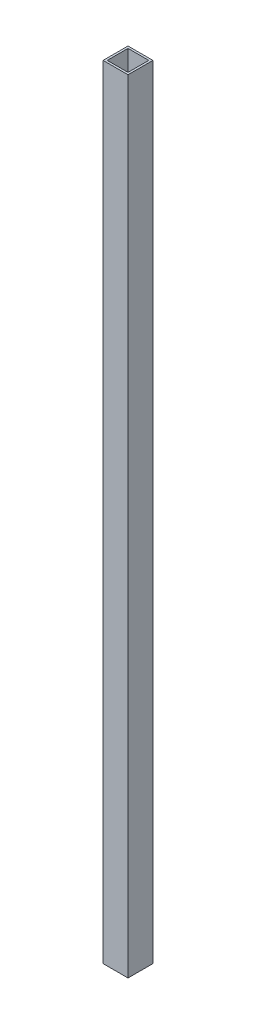
ISO-10303-21;
HEADER;
FILE_DESCRIPTION(('STEP AP214'),'2;1');
FILE_NAME('part.step','',(''),(''),'','','');
FILE_SCHEMA(('AUTOMOTIVE_DESIGN { 1 0 10303 214 1 1 1 1 }'));
ENDSEC;
DATA;
#1=APPLICATION_CONTEXT('core data for automotive mechanical design processes');
#2=APPLICATION_PROTOCOL_DEFINITION('international standard','automotive_design',2000,#1);
#3=PRODUCT_CONTEXT('',#1,'mechanical');
#4=PRODUCT('Part','Part','',(#3));
#5=PRODUCT_RELATED_PRODUCT_CATEGORY('part','',(#4));
#6=PRODUCT_DEFINITION_FORMATION('','',#4);
#7=PRODUCT_DEFINITION_CONTEXT('part definition',#1,'design');
#8=PRODUCT_DEFINITION('design','',#6,#7);
#9=PRODUCT_DEFINITION_SHAPE('','',#8);
#10=(LENGTH_UNIT() NAMED_UNIT(*) SI_UNIT(.MILLI.,.METRE.));
#11=(NAMED_UNIT(*) PLANE_ANGLE_UNIT() SI_UNIT($,.RADIAN.));
#12=(NAMED_UNIT(*) SI_UNIT($,.STERADIAN.) SOLID_ANGLE_UNIT());
#13=UNCERTAINTY_MEASURE_WITH_UNIT(LENGTH_MEASURE(1.E-05),#10,'distance_accuracy_value','');
#14=(GEOMETRIC_REPRESENTATION_CONTEXT(3) GLOBAL_UNCERTAINTY_ASSIGNED_CONTEXT((#13)) GLOBAL_UNIT_ASSIGNED_CONTEXT((#10,
#11,#12)) REPRESENTATION_CONTEXT('',''));
#15=CARTESIAN_POINT('',(0.,0.,0.));
#16=DIRECTION('',(0.,0.,1.));
#17=DIRECTION('',(1.,0.,0.));
#18=AXIS2_PLACEMENT_3D('',#15,#16,#17);
#19=CARTESIAN_POINT('',(0.,152.4,0.));
#20=DIRECTION('',(0.,1.,0.));
#21=DIRECTION('',(0.,0.,1.));
#22=AXIS2_PLACEMENT_3D('',#19,#20,#21);
#23=PLANE('',#22);
#24=DIRECTION('',(0.,0.,-1.));
#25=VECTOR('',#24,1.);
#26=CARTESIAN_POINT('',(2.425,152.4,-2.425));
#27=LINE('',#26,#25);
#28=CARTESIAN_POINT('',(2.425,152.4,2.425));
#29=VERTEX_POINT('',#28);
#30=CARTESIAN_POINT('',(2.425,152.4,-2.425));
#31=VERTEX_POINT('',#30);
#32=EDGE_CURVE('E135',#29,#31,#27,.T.);
#33=ORIENTED_EDGE('',*,*,#32,.T.);
#34=DIRECTION('',(-1.,0.,0.));
#35=VECTOR('',#34,1.);
#36=CARTESIAN_POINT('',(-2.425,152.4,-2.425));
#37=LINE('',#36,#35);
#38=CARTESIAN_POINT('',(-2.425,152.4,-2.425));
#39=VERTEX_POINT('',#38);
#40=EDGE_CURVE('E138',#31,#39,#37,.T.);
#41=ORIENTED_EDGE('',*,*,#40,.T.);
#42=DIRECTION('',(0.,0.,1.));
#43=VECTOR('',#42,1.);
#44=CARTESIAN_POINT('',(-2.425,152.4,-2.425));
#45=LINE('',#44,#43);
#46=CARTESIAN_POINT('',(-2.425,152.4,2.425));
#47=VERTEX_POINT('',#46);
#48=EDGE_CURVE('E141',#39,#47,#45,.T.);
#49=ORIENTED_EDGE('',*,*,#48,.T.);
#50=DIRECTION('',(1.,0.,0.));
#51=VECTOR('',#50,1.);
#52=CARTESIAN_POINT('',(-2.425,152.4,2.425));
#53=LINE('',#52,#51);
#54=EDGE_CURVE('E143',#47,#29,#53,.T.);
#55=ORIENTED_EDGE('',*,*,#54,.T.);
#56=EDGE_LOOP('',(#33,#41,#49,#55));
#57=FACE_BOUND('',#56,.T.);
#58=DIRECTION('',(1.,0.,0.));
#59=VECTOR('',#58,1.);
#60=CARTESIAN_POINT('',(-2.025,152.4,2.025));
#61=LINE('',#60,#59);
#62=CARTESIAN_POINT('',(-2.025,152.4,2.025));
#63=VERTEX_POINT('',#62);
#64=CARTESIAN_POINT('',(2.025,152.4,2.025));
#65=VERTEX_POINT('',#64);
#66=EDGE_CURVE('E107',#63,#65,#61,.T.);
#67=ORIENTED_EDGE('',*,*,#66,.F.);
#68=DIRECTION('',(0.,0.,1.));
#69=VECTOR('',#68,1.);
#70=CARTESIAN_POINT('',(-2.025,152.4,-2.025));
#71=LINE('',#70,#69);
#72=CARTESIAN_POINT('',(-2.025,152.4,-2.025));
#73=VERTEX_POINT('',#72);
#74=EDGE_CURVE('E99',#73,#63,#71,.T.);
#75=ORIENTED_EDGE('',*,*,#74,.F.);
#76=DIRECTION('',(-1.,0.,0.));
#77=VECTOR('',#76,1.);
#78=CARTESIAN_POINT('',(-2.025,152.4,-2.025));
#79=LINE('',#78,#77);
#80=CARTESIAN_POINT('',(2.025,152.4,-2.025));
#81=VERTEX_POINT('',#80);
#82=EDGE_CURVE('E121',#81,#73,#79,.T.);
#83=ORIENTED_EDGE('',*,*,#82,.F.);
#84=DIRECTION('',(0.,0.,-1.));
#85=VECTOR('',#84,1.);
#86=CARTESIAN_POINT('',(2.025,152.4,-2.025));
#87=LINE('',#86,#85);
#88=EDGE_CURVE('E119',#65,#81,#87,.T.);
#89=ORIENTED_EDGE('',*,*,#88,.F.);
#90=EDGE_LOOP('',(#67,#75,#83,#89));
#91=FACE_BOUND('',#90,.T.);
#92=ADVANCED_FACE('F34',(#57,#91),#23,.T.);
#93=CARTESIAN_POINT('',(0.,0.,0.));
#94=DIRECTION('',(0.,1.,0.));
#95=DIRECTION('',(0.,0.,1.));
#96=AXIS2_PLACEMENT_3D('',#93,#94,#95);
#97=PLANE('',#96);
#98=DIRECTION('',(0.,0.,-1.));
#99=VECTOR('',#98,1.);
#100=CARTESIAN_POINT('',(2.425,0.,-2.425));
#101=LINE('',#100,#99);
#102=CARTESIAN_POINT('',(2.425,0.,2.425));
#103=VERTEX_POINT('',#102);
#104=CARTESIAN_POINT('',(2.425,0.,-2.425));
#105=VERTEX_POINT('',#104);
#106=EDGE_CURVE('E115',#103,#105,#101,.T.);
#107=ORIENTED_EDGE('',*,*,#106,.F.);
#108=DIRECTION('',(1.,0.,0.));
#109=VECTOR('',#108,1.);
#110=CARTESIAN_POINT('',(-2.425,0.,2.425));
#111=LINE('',#110,#109);
#112=CARTESIAN_POINT('',(-2.425,0.,2.425));
#113=VERTEX_POINT('',#112);
#114=EDGE_CURVE('E139',#113,#103,#111,.T.);
#115=ORIENTED_EDGE('',*,*,#114,.F.);
#116=DIRECTION('',(0.,0.,1.));
#117=VECTOR('',#116,1.);
#118=CARTESIAN_POINT('',(-2.425,0.,-2.425));
#119=LINE('',#118,#117);
#120=CARTESIAN_POINT('',(-2.425,0.,-2.425));
#121=VERTEX_POINT('',#120);
#122=EDGE_CURVE('E150',#121,#113,#119,.T.);
#123=ORIENTED_EDGE('',*,*,#122,.F.);
#124=DIRECTION('',(-1.,0.,0.));
#125=VECTOR('',#124,1.);
#126=CARTESIAN_POINT('',(-2.425,0.,-2.425));
#127=LINE('',#126,#125);
#128=EDGE_CURVE('E148',#105,#121,#127,.T.);
#129=ORIENTED_EDGE('',*,*,#128,.F.);
#130=EDGE_LOOP('',(#107,#115,#123,#129));
#131=FACE_BOUND('',#130,.T.);
#132=DIRECTION('',(0.,0.,1.));
#133=VECTOR('',#132,1.);
#134=CARTESIAN_POINT('',(-2.025,0.,-2.025));
#135=LINE('',#134,#133);
#136=CARTESIAN_POINT('',(-2.025,0.,-2.025));
#137=VERTEX_POINT('',#136);
#138=CARTESIAN_POINT('',(-2.025,0.,2.025));
#139=VERTEX_POINT('',#138);
#140=EDGE_CURVE('E57',#137,#139,#135,.T.);
#141=ORIENTED_EDGE('',*,*,#140,.T.);
#142=DIRECTION('',(1.,0.,0.));
#143=VECTOR('',#142,1.);
#144=CARTESIAN_POINT('',(-2.025,0.,2.025));
#145=LINE('',#144,#143);
#146=CARTESIAN_POINT('',(2.025,0.,2.025));
#147=VERTEX_POINT('',#146);
#148=EDGE_CURVE('E114',#139,#147,#145,.T.);
#149=ORIENTED_EDGE('',*,*,#148,.T.);
#150=DIRECTION('',(0.,0.,-1.));
#151=VECTOR('',#150,1.);
#152=CARTESIAN_POINT('',(2.025,0.,-2.025));
#153=LINE('',#152,#151);
#154=CARTESIAN_POINT('',(2.025,0.,-2.025));
#155=VERTEX_POINT('',#154);
#156=EDGE_CURVE('E127',#147,#155,#153,.T.);
#157=ORIENTED_EDGE('',*,*,#156,.T.);
#158=DIRECTION('',(-1.,0.,0.));
#159=VECTOR('',#158,1.);
#160=CARTESIAN_POINT('',(-2.025,0.,-2.025));
#161=LINE('',#160,#159);
#162=EDGE_CURVE('E108',#155,#137,#161,.T.);
#163=ORIENTED_EDGE('',*,*,#162,.T.);
#164=EDGE_LOOP('',(#141,#149,#157,#163));
#165=FACE_BOUND('',#164,.T.);
#166=ADVANCED_FACE('F168',(#131,#165),#97,.F.);
#167=CARTESIAN_POINT('',(2.425,152.4,-2.425));
#168=DIRECTION('',(-1.,0.,0.));
#169=DIRECTION('',(0.,0.,1.));
#170=AXIS2_PLACEMENT_3D('',#167,#168,#169);
#171=PLANE('',#170);
#172=ORIENTED_EDGE('',*,*,#106,.T.);
#173=DIRECTION('',(0.,-1.,0.));
#174=VECTOR('',#173,1.);
#175=CARTESIAN_POINT('',(2.425,152.4,-2.425));
#176=LINE('',#175,#174);
#177=EDGE_CURVE('E11',#31,#105,#176,.T.);
#178=ORIENTED_EDGE('',*,*,#177,.F.);
#179=ORIENTED_EDGE('',*,*,#32,.F.);
#180=DIRECTION('',(0.,-1.,0.));
#181=VECTOR('',#180,1.);
#182=CARTESIAN_POINT('',(2.425,152.4,2.425));
#183=LINE('',#182,#181);
#184=EDGE_CURVE('E145',#29,#103,#183,.T.);
#185=ORIENTED_EDGE('',*,*,#184,.T.);
#186=EDGE_LOOP('',(#172,#178,#179,#185));
#187=FACE_BOUND('',#186,.T.);
#188=ADVANCED_FACE('F36',(#187),#171,.F.);
#189=CARTESIAN_POINT('',(-2.425,152.4,-2.425));
#190=DIRECTION('',(0.,0.,1.));
#191=DIRECTION('',(1.,0.,0.));
#192=AXIS2_PLACEMENT_3D('',#189,#190,#191);
#193=PLANE('',#192);
#194=ORIENTED_EDGE('',*,*,#128,.T.);
#195=DIRECTION('',(0.,-1.,0.));
#196=VECTOR('',#195,1.);
#197=CARTESIAN_POINT('',(-2.425,152.4,-2.425));
#198=LINE('',#197,#196);
#199=EDGE_CURVE('E42',#39,#121,#198,.T.);
#200=ORIENTED_EDGE('',*,*,#199,.F.);
#201=ORIENTED_EDGE('',*,*,#40,.F.);
#202=ORIENTED_EDGE('',*,*,#177,.T.);
#203=EDGE_LOOP('',(#194,#200,#201,#202));
#204=FACE_BOUND('',#203,.T.);
#205=ADVANCED_FACE('F178',(#204),#193,.F.);
#206=CARTESIAN_POINT('',(-2.425,152.4,-2.425));
#207=DIRECTION('',(1.,0.,0.));
#208=DIRECTION('',(0.,0.,-1.));
#209=AXIS2_PLACEMENT_3D('',#206,#207,#208);
#210=PLANE('',#209);
#211=ORIENTED_EDGE('',*,*,#122,.T.);
#212=DIRECTION('',(0.,-1.,0.));
#213=VECTOR('',#212,1.);
#214=CARTESIAN_POINT('',(-2.425,152.4,2.425));
#215=LINE('',#214,#213);
#216=EDGE_CURVE('E155',#47,#113,#215,.T.);
#217=ORIENTED_EDGE('',*,*,#216,.F.);
#218=ORIENTED_EDGE('',*,*,#48,.F.);
#219=ORIENTED_EDGE('',*,*,#199,.T.);
#220=EDGE_LOOP('',(#211,#217,#218,#219));
#221=FACE_BOUND('',#220,.T.);
#222=ADVANCED_FACE('F162',(#221),#210,.F.);
#223=CARTESIAN_POINT('',(-2.425,152.4,2.425));
#224=DIRECTION('',(0.,0.,-1.));
#225=DIRECTION('',(-1.,0.,0.));
#226=AXIS2_PLACEMENT_3D('',#223,#224,#225);
#227=PLANE('',#226);
#228=ORIENTED_EDGE('',*,*,#114,.T.);
#229=ORIENTED_EDGE('',*,*,#184,.F.);
#230=ORIENTED_EDGE('',*,*,#54,.F.);
#231=ORIENTED_EDGE('',*,*,#216,.T.);
#232=EDGE_LOOP('',(#228,#229,#230,#231));
#233=FACE_BOUND('',#232,.T.);
#234=ADVANCED_FACE('F172',(#233),#227,.F.);
#235=CARTESIAN_POINT('',(-2.025,152.4,-2.025));
#236=DIRECTION('',(1.,0.,0.));
#237=DIRECTION('',(0.,0.,-1.));
#238=AXIS2_PLACEMENT_3D('',#235,#236,#237);
#239=PLANE('',#238);
#240=ORIENTED_EDGE('',*,*,#140,.F.);
#241=DIRECTION('',(0.,-1.,0.));
#242=VECTOR('',#241,1.);
#243=CARTESIAN_POINT('',(-2.025,152.4,-2.025));
#244=LINE('',#243,#242);
#245=EDGE_CURVE('E103',#73,#137,#244,.T.);
#246=ORIENTED_EDGE('',*,*,#245,.F.);
#247=ORIENTED_EDGE('',*,*,#74,.T.);
#248=DIRECTION('',(0.,-1.,0.));
#249=VECTOR('',#248,1.);
#250=CARTESIAN_POINT('',(-2.025,152.4,2.025));
#251=LINE('',#250,#249);
#252=EDGE_CURVE('E102',#63,#139,#251,.T.);
#253=ORIENTED_EDGE('',*,*,#252,.T.);
#254=EDGE_LOOP('',(#240,#246,#247,#253));
#255=FACE_BOUND('',#254,.T.);
#256=ADVANCED_FACE('F101',(#255),#239,.T.);
#257=CARTESIAN_POINT('',(-2.025,152.4,2.025));
#258=DIRECTION('',(0.,0.,-1.));
#259=DIRECTION('',(-1.,0.,0.));
#260=AXIS2_PLACEMENT_3D('',#257,#258,#259);
#261=PLANE('',#260);
#262=ORIENTED_EDGE('',*,*,#148,.F.);
#263=ORIENTED_EDGE('',*,*,#252,.F.);
#264=ORIENTED_EDGE('',*,*,#66,.T.);
#265=DIRECTION('',(0.,-1.,0.));
#266=VECTOR('',#265,1.);
#267=CARTESIAN_POINT('',(2.025,152.4,2.025));
#268=LINE('',#267,#266);
#269=EDGE_CURVE('E116',#65,#147,#268,.T.);
#270=ORIENTED_EDGE('',*,*,#269,.T.);
#271=EDGE_LOOP('',(#262,#263,#264,#270));
#272=FACE_BOUND('',#271,.T.);
#273=ADVANCED_FACE('F111',(#272),#261,.T.);
#274=CARTESIAN_POINT('',(2.025,152.4,-2.025));
#275=DIRECTION('',(-1.,0.,0.));
#276=DIRECTION('',(0.,0.,1.));
#277=AXIS2_PLACEMENT_3D('',#274,#275,#276);
#278=PLANE('',#277);
#279=ORIENTED_EDGE('',*,*,#156,.F.);
#280=ORIENTED_EDGE('',*,*,#269,.F.);
#281=ORIENTED_EDGE('',*,*,#88,.T.);
#282=DIRECTION('',(0.,-1.,0.));
#283=VECTOR('',#282,1.);
#284=CARTESIAN_POINT('',(2.025,152.4,-2.025));
#285=LINE('',#284,#283);
#286=EDGE_CURVE('E49',#81,#155,#285,.T.);
#287=ORIENTED_EDGE('',*,*,#286,.T.);
#288=EDGE_LOOP('',(#279,#280,#281,#287));
#289=FACE_BOUND('',#288,.T.);
#290=ADVANCED_FACE('F201',(#289),#278,.T.);
#291=CARTESIAN_POINT('',(-2.025,152.4,-2.025));
#292=DIRECTION('',(0.,0.,1.));
#293=DIRECTION('',(1.,0.,0.));
#294=AXIS2_PLACEMENT_3D('',#291,#292,#293);
#295=PLANE('',#294);
#296=ORIENTED_EDGE('',*,*,#162,.F.);
#297=ORIENTED_EDGE('',*,*,#286,.F.);
#298=ORIENTED_EDGE('',*,*,#82,.T.);
#299=ORIENTED_EDGE('',*,*,#245,.T.);
#300=EDGE_LOOP('',(#296,#297,#298,#299));
#301=FACE_BOUND('',#300,.T.);
#302=ADVANCED_FACE('F205',(#301),#295,.T.);
#303=CLOSED_SHELL('',(#92,#166,#188,#205,#222,#234,#256,#273,#290,#302));
#304=MANIFOLD_SOLID_BREP('B2',#303);
#305=ADVANCED_BREP_SHAPE_REPRESENTATION('',(#18,#304),#14);
#306=SHAPE_DEFINITION_REPRESENTATION(#9,#305);
ENDSEC;
END-ISO-10303-21;
